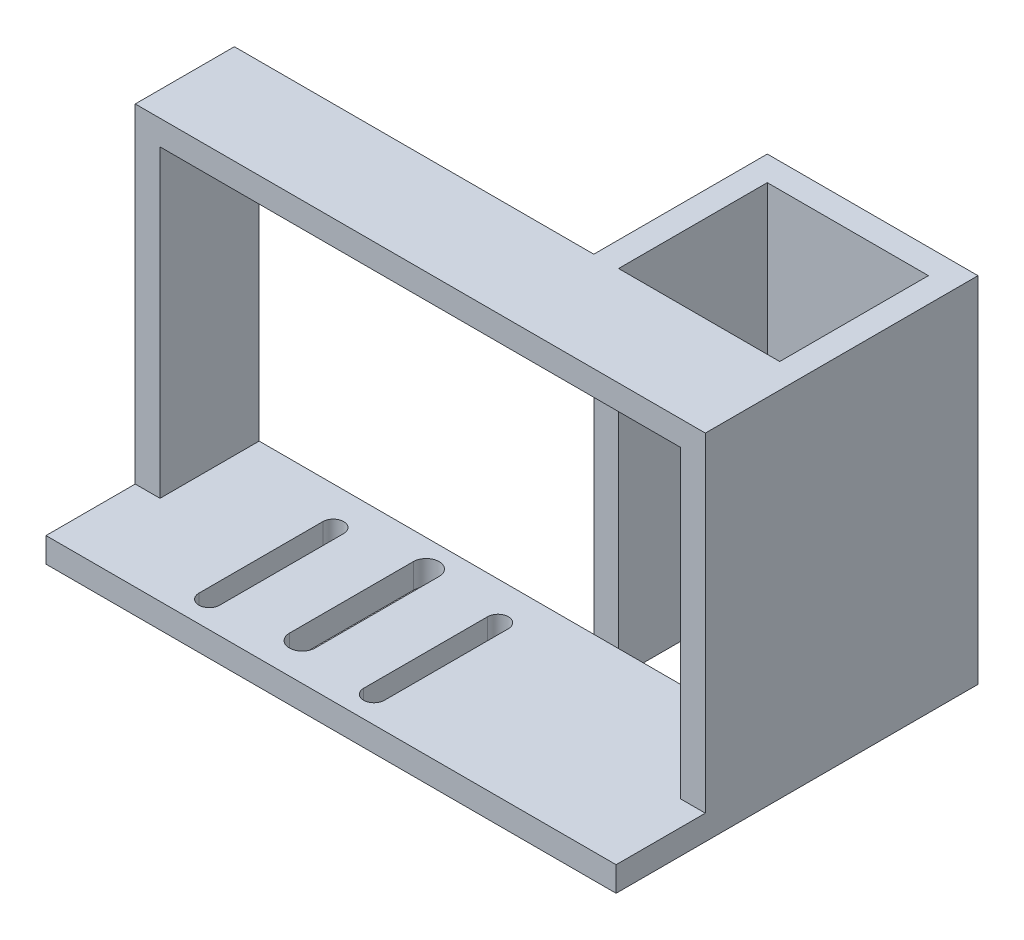
ISO-10303-21;
HEADER;
FILE_DESCRIPTION(('STEP AP214'),'2;1');
FILE_NAME('part.step','',(''),(''),'','','');
FILE_SCHEMA(('AUTOMOTIVE_DESIGN { 1 0 10303 214 1 1 1 1 }'));
ENDSEC;
DATA;
#1=APPLICATION_CONTEXT('core data for automotive mechanical design processes');
#2=APPLICATION_PROTOCOL_DEFINITION('international standard','automotive_design',2000,#1);
#3=PRODUCT_CONTEXT('',#1,'mechanical');
#4=PRODUCT('Part','Part','',(#3));
#5=PRODUCT_RELATED_PRODUCT_CATEGORY('part','',(#4));
#6=PRODUCT_DEFINITION_FORMATION('','',#4);
#7=PRODUCT_DEFINITION_CONTEXT('part definition',#1,'design');
#8=PRODUCT_DEFINITION('design','',#6,#7);
#9=PRODUCT_DEFINITION_SHAPE('','',#8);
#10=(LENGTH_UNIT() NAMED_UNIT(*) SI_UNIT(.MILLI.,.METRE.));
#11=(NAMED_UNIT(*) PLANE_ANGLE_UNIT() SI_UNIT($,.RADIAN.));
#12=(NAMED_UNIT(*) SI_UNIT($,.STERADIAN.) SOLID_ANGLE_UNIT());
#13=UNCERTAINTY_MEASURE_WITH_UNIT(LENGTH_MEASURE(1.E-05),#10,'distance_accuracy_value','');
#14=(GEOMETRIC_REPRESENTATION_CONTEXT(3) GLOBAL_UNCERTAINTY_ASSIGNED_CONTEXT((#13)) GLOBAL_UNIT_ASSIGNED_CONTEXT((#10,
#11,#12)) REPRESENTATION_CONTEXT('',''));
#15=CARTESIAN_POINT('',(0.,0.,0.));
#16=DIRECTION('',(0.,0.,1.));
#17=DIRECTION('',(1.,0.,0.));
#18=AXIS2_PLACEMENT_3D('',#15,#16,#17);
#19=CARTESIAN_POINT('',(0.,0.,25.4));
#20=DIRECTION('',(0.,0.,-1.));
#21=DIRECTION('',(-1.,0.,0.));
#22=AXIS2_PLACEMENT_3D('',#19,#20,#21);
#23=PLANE('',#22);
#24=DIRECTION('',(-1.,0.,0.));
#25=VECTOR('',#24,1.);
#26=CARTESIAN_POINT('',(0.,-38.989,25.4));
#27=LINE('',#26,#25);
#28=CARTESIAN_POINT('',(73.025,-38.989,25.4));
#29=VERTEX_POINT('',#28);
#30=CARTESIAN_POINT('',(66.675,-38.989,25.4));
#31=VERTEX_POINT('',#30);
#32=EDGE_CURVE('E350',#29,#31,#27,.T.);
#33=ORIENTED_EDGE('',*,*,#32,.F.);
#34=DIRECTION('',(0.,1.,0.));
#35=VECTOR('',#34,1.);
#36=CARTESIAN_POINT('',(73.025,-45.339,25.4));
#37=LINE('',#36,#35);
#38=CARTESIAN_POINT('',(73.025,45.339,25.4));
#39=VERTEX_POINT('',#38);
#40=EDGE_CURVE('E381',#29,#39,#37,.T.);
#41=ORIENTED_EDGE('',*,*,#40,.T.);
#42=DIRECTION('',(-1.,0.,0.));
#43=VECTOR('',#42,1.);
#44=CARTESIAN_POINT('',(-73.025,45.339,25.4));
#45=LINE('',#44,#43);
#46=CARTESIAN_POINT('',(-73.025,45.339,25.4));
#47=VERTEX_POINT('',#46);
#48=EDGE_CURVE('E380',#39,#47,#45,.T.);
#49=ORIENTED_EDGE('',*,*,#48,.T.);
#50=DIRECTION('',(0.,-1.,0.));
#51=VECTOR('',#50,1.);
#52=CARTESIAN_POINT('',(-73.025,-45.339,25.4));
#53=LINE('',#52,#51);
#54=CARTESIAN_POINT('',(-73.025,-38.989,25.4));
#55=VERTEX_POINT('',#54);
#56=EDGE_CURVE('E336',#47,#55,#53,.T.);
#57=ORIENTED_EDGE('',*,*,#56,.T.);
#58=CARTESIAN_POINT('',(-66.675,-38.989,25.4));
#59=VERTEX_POINT('',#58);
#60=EDGE_CURVE('E323',#59,#55,#27,.T.);
#61=ORIENTED_EDGE('',*,*,#60,.F.);
#62=DIRECTION('',(0.,-1.,0.));
#63=VECTOR('',#62,1.);
#64=CARTESIAN_POINT('',(-66.675,-38.989,25.4));
#65=LINE('',#64,#63);
#66=CARTESIAN_POINT('',(-66.675,38.989,25.4));
#67=VERTEX_POINT('',#66);
#68=EDGE_CURVE('E370',#67,#59,#65,.T.);
#69=ORIENTED_EDGE('',*,*,#68,.F.);
#70=DIRECTION('',(-1.,0.,0.));
#71=VECTOR('',#70,1.);
#72=CARTESIAN_POINT('',(-66.675,38.989,25.4));
#73=LINE('',#72,#71);
#74=CARTESIAN_POINT('',(66.675,38.989,25.4));
#75=VERTEX_POINT('',#74);
#76=EDGE_CURVE('E356',#75,#67,#73,.T.);
#77=ORIENTED_EDGE('',*,*,#76,.F.);
#78=DIRECTION('',(0.,1.,0.));
#79=VECTOR('',#78,1.);
#80=CARTESIAN_POINT('',(66.675,-38.989,25.4));
#81=LINE('',#80,#79);
#82=EDGE_CURVE('E359',#31,#75,#81,.T.);
#83=ORIENTED_EDGE('',*,*,#82,.F.);
#84=EDGE_LOOP('',(#33,#41,#49,#57,#61,#69,#77,#83));
#85=FACE_BOUND('',#84,.T.);
#86=ADVANCED_FACE('F37',(#85),#23,.F.);
#87=CARTESIAN_POINT('',(0.,0.,0.));
#88=DIRECTION('',(0.,0.,-1.));
#89=DIRECTION('',(-1.,0.,0.));
#90=AXIS2_PLACEMENT_3D('',#87,#88,#89);
#91=PLANE('',#90);
#92=DIRECTION('',(0.,1.,0.));
#93=VECTOR('',#92,1.);
#94=CARTESIAN_POINT('',(19.05,45.339,0.));
#95=LINE('',#94,#93);
#96=CARTESIAN_POINT('',(19.05,-45.339,0.));
#97=VERTEX_POINT('',#96);
#98=CARTESIAN_POINT('',(19.05,-38.989,0.));
#99=VERTEX_POINT('',#98);
#100=EDGE_CURVE('E280',#97,#99,#95,.T.);
#101=ORIENTED_EDGE('',*,*,#100,.F.);
#102=DIRECTION('',(1.,0.,0.));
#103=VECTOR('',#102,1.);
#104=CARTESIAN_POINT('',(-73.025,-45.339,0.));
#105=LINE('',#104,#103);
#106=CARTESIAN_POINT('',(-73.025,-45.339,0.));
#107=VERTEX_POINT('',#106);
#108=EDGE_CURVE('E382',#107,#97,#105,.T.);
#109=ORIENTED_EDGE('',*,*,#108,.F.);
#110=DIRECTION('',(0.,-1.,0.));
#111=VECTOR('',#110,1.);
#112=CARTESIAN_POINT('',(-73.025,-45.339,0.));
#113=LINE('',#112,#111);
#114=CARTESIAN_POINT('',(-73.025,45.339,0.));
#115=VERTEX_POINT('',#114);
#116=EDGE_CURVE('E392',#115,#107,#113,.T.);
#117=ORIENTED_EDGE('',*,*,#116,.F.);
#118=DIRECTION('',(-1.,0.,0.));
#119=VECTOR('',#118,1.);
#120=CARTESIAN_POINT('',(-73.025,45.339,0.));
#121=LINE('',#120,#119);
#122=CARTESIAN_POINT('',(19.05,45.339,0.));
#123=VERTEX_POINT('',#122);
#124=EDGE_CURVE('E315',#123,#115,#121,.T.);
#125=ORIENTED_EDGE('',*,*,#124,.F.);
#126=CARTESIAN_POINT('',(19.05,38.989,0.));
#127=VERTEX_POINT('',#126);
#128=EDGE_CURVE('E45',#127,#123,#95,.T.);
#129=ORIENTED_EDGE('',*,*,#128,.F.);
#130=DIRECTION('',(-1.,0.,0.));
#131=VECTOR('',#130,1.);
#132=CARTESIAN_POINT('',(-66.675,38.989,0.));
#133=LINE('',#132,#131);
#134=CARTESIAN_POINT('',(-66.675,38.989,0.));
#135=VERTEX_POINT('',#134);
#136=EDGE_CURVE('E366',#127,#135,#133,.T.);
#137=ORIENTED_EDGE('',*,*,#136,.T.);
#138=DIRECTION('',(0.,-1.,0.));
#139=VECTOR('',#138,1.);
#140=CARTESIAN_POINT('',(-66.675,-38.989,0.));
#141=LINE('',#140,#139);
#142=CARTESIAN_POINT('',(-66.675,-38.989,0.));
#143=VERTEX_POINT('',#142);
#144=EDGE_CURVE('E354',#135,#143,#141,.T.);
#145=ORIENTED_EDGE('',*,*,#144,.T.);
#146=DIRECTION('',(1.,0.,0.));
#147=VECTOR('',#146,1.);
#148=CARTESIAN_POINT('',(-66.675,-38.989,0.));
#149=LINE('',#148,#147);
#150=EDGE_CURVE('E363',#143,#99,#149,.T.);
#151=ORIENTED_EDGE('',*,*,#150,.T.);
#152=EDGE_LOOP('',(#101,#109,#117,#125,#129,#137,#145,#151));
#153=FACE_BOUND('',#152,.T.);
#154=ADVANCED_FACE('F559',(#153),#91,.T.);
#155=CARTESIAN_POINT('',(73.025,-45.339,25.4));
#156=DIRECTION('',(-1.,0.,0.));
#157=DIRECTION('',(0.,0.,1.));
#158=AXIS2_PLACEMENT_3D('',#155,#156,#157);
#159=PLANE('',#158);
#160=DIRECTION('',(0.,0.,-1.));
#161=VECTOR('',#160,1.);
#162=CARTESIAN_POINT('',(73.025,-45.339,25.4));
#163=LINE('',#162,#161);
#164=CARTESIAN_POINT('',(73.025,-45.339,48.26));
#165=VERTEX_POINT('',#164);
#166=CARTESIAN_POINT('',(73.025,-45.339,-44.45));
#167=VERTEX_POINT('',#166);
#168=EDGE_CURVE('E388',#165,#167,#163,.T.);
#169=ORIENTED_EDGE('',*,*,#168,.T.);
#170=DIRECTION('',(0.,-1.,0.));
#171=VECTOR('',#170,1.);
#172=CARTESIAN_POINT('',(73.025,45.339,-44.45));
#173=LINE('',#172,#171);
#174=CARTESIAN_POINT('',(73.025,45.339,-44.45));
#175=VERTEX_POINT('',#174);
#176=EDGE_CURVE('E276',#175,#167,#173,.T.);
#177=ORIENTED_EDGE('',*,*,#176,.F.);
#178=DIRECTION('',(0.,0.,-1.));
#179=VECTOR('',#178,1.);
#180=CARTESIAN_POINT('',(73.025,45.339,25.4));
#181=LINE('',#180,#179);
#182=EDGE_CURVE('E325',#39,#175,#181,.T.);
#183=ORIENTED_EDGE('',*,*,#182,.F.);
#184=ORIENTED_EDGE('',*,*,#40,.F.);
#185=DIRECTION('',(0.,0.,1.));
#186=VECTOR('',#185,1.);
#187=CARTESIAN_POINT('',(73.025,-38.989,0.));
#188=LINE('',#187,#186);
#189=CARTESIAN_POINT('',(73.025,-38.989,48.26));
#190=VERTEX_POINT('',#189);
#191=EDGE_CURVE('E420',#29,#190,#188,.T.);
#192=ORIENTED_EDGE('',*,*,#191,.T.);
#193=DIRECTION('',(0.,-1.,0.));
#194=VECTOR('',#193,1.);
#195=CARTESIAN_POINT('',(73.025,108.839218212897,48.26));
#196=LINE('',#195,#194);
#197=EDGE_CURVE('E421',#190,#165,#196,.T.);
#198=ORIENTED_EDGE('',*,*,#197,.T.);
#199=EDGE_LOOP('',(#169,#177,#183,#184,#192,#198));
#200=FACE_BOUND('',#199,.T.);
#201=ADVANCED_FACE('F39',(#200),#159,.F.);
#202=CARTESIAN_POINT('',(-73.025,45.339,25.4));
#203=DIRECTION('',(0.,-1.,0.));
#204=DIRECTION('',(0.,0.,-1.));
#205=AXIS2_PLACEMENT_3D('',#202,#203,#204);
#206=PLANE('',#205);
#207=DIRECTION('',(1.,0.,0.));
#208=VECTOR('',#207,1.);
#209=CARTESIAN_POINT('',(25.4,45.339,0.));
#210=LINE('',#209,#208);
#211=CARTESIAN_POINT('',(25.4,45.339,0.));
#212=VERTEX_POINT('',#211);
#213=CARTESIAN_POINT('',(66.675,45.339,0.));
#214=VERTEX_POINT('',#213);
#215=EDGE_CURVE('E259',#212,#214,#210,.T.);
#216=ORIENTED_EDGE('',*,*,#215,.F.);
#217=DIRECTION('',(0.,0.,1.));
#218=VECTOR('',#217,1.);
#219=CARTESIAN_POINT('',(25.4,45.339,-38.1));
#220=LINE('',#219,#218);
#221=CARTESIAN_POINT('',(25.4,45.339,-38.1));
#222=VERTEX_POINT('',#221);
#223=EDGE_CURVE('E52',#222,#212,#220,.T.);
#224=ORIENTED_EDGE('',*,*,#223,.F.);
#225=DIRECTION('',(-1.,0.,0.));
#226=VECTOR('',#225,1.);
#227=CARTESIAN_POINT('',(25.4,45.339,-38.1));
#228=LINE('',#227,#226);
#229=CARTESIAN_POINT('',(66.675,45.339,-38.1));
#230=VERTEX_POINT('',#229);
#231=EDGE_CURVE('E269',#230,#222,#228,.T.);
#232=ORIENTED_EDGE('',*,*,#231,.F.);
#233=DIRECTION('',(0.,0.,-1.));
#234=VECTOR('',#233,1.);
#235=CARTESIAN_POINT('',(66.675,45.339,-38.1));
#236=LINE('',#235,#234);
#237=EDGE_CURVE('E266',#214,#230,#236,.T.);
#238=ORIENTED_EDGE('',*,*,#237,.F.);
#239=EDGE_LOOP('',(#216,#224,#232,#238));
#240=FACE_BOUND('',#239,.T.);
#241=ORIENTED_EDGE('',*,*,#182,.T.);
#242=DIRECTION('',(1.,0.,0.));
#243=VECTOR('',#242,1.);
#244=CARTESIAN_POINT('',(73.025,45.339,-44.45));
#245=LINE('',#244,#243);
#246=CARTESIAN_POINT('',(19.05,45.339,-44.45));
#247=VERTEX_POINT('',#246);
#248=EDGE_CURVE('E284',#247,#175,#245,.T.);
#249=ORIENTED_EDGE('',*,*,#248,.F.);
#250=DIRECTION('',(0.,0.,1.));
#251=VECTOR('',#250,1.);
#252=CARTESIAN_POINT('',(19.05,45.339,-44.45));
#253=LINE('',#252,#251);
#254=EDGE_CURVE('E287',#247,#123,#253,.T.);
#255=ORIENTED_EDGE('',*,*,#254,.T.);
#256=ORIENTED_EDGE('',*,*,#124,.T.);
#257=DIRECTION('',(0.,0.,-1.));
#258=VECTOR('',#257,1.);
#259=CARTESIAN_POINT('',(-73.025,45.339,25.4));
#260=LINE('',#259,#258);
#261=EDGE_CURVE('E331',#47,#115,#260,.T.);
#262=ORIENTED_EDGE('',*,*,#261,.F.);
#263=ORIENTED_EDGE('',*,*,#48,.F.);
#264=EDGE_LOOP('',(#241,#249,#255,#256,#262,#263));
#265=FACE_BOUND('',#264,.T.);
#266=ADVANCED_FACE('F313',(#240,#265),#206,.F.);
#267=CARTESIAN_POINT('',(-73.025,-45.339,25.4));
#268=DIRECTION('',(1.,0.,0.));
#269=DIRECTION('',(0.,0.,-1.));
#270=AXIS2_PLACEMENT_3D('',#267,#268,#269);
#271=PLANE('',#270);
#272=ORIENTED_EDGE('',*,*,#116,.T.);
#273=DIRECTION('',(0.,0.,-1.));
#274=VECTOR('',#273,1.);
#275=CARTESIAN_POINT('',(-73.025,-45.339,25.4));
#276=LINE('',#275,#274);
#277=CARTESIAN_POINT('',(-73.025,-45.339,48.26));
#278=VERTEX_POINT('',#277);
#279=EDGE_CURVE('E385',#278,#107,#276,.T.);
#280=ORIENTED_EDGE('',*,*,#279,.F.);
#281=DIRECTION('',(0.,-1.,0.));
#282=VECTOR('',#281,1.);
#283=CARTESIAN_POINT('',(-73.025,108.839218212897,48.26));
#284=LINE('',#283,#282);
#285=CARTESIAN_POINT('',(-73.025,-38.989,48.26));
#286=VERTEX_POINT('',#285);
#287=EDGE_CURVE('E355',#286,#278,#284,.T.);
#288=ORIENTED_EDGE('',*,*,#287,.F.);
#289=DIRECTION('',(0.,0.,1.));
#290=VECTOR('',#289,1.);
#291=CARTESIAN_POINT('',(-73.025,-38.989,0.));
#292=LINE('',#291,#290);
#293=EDGE_CURVE('E339',#55,#286,#292,.T.);
#294=ORIENTED_EDGE('',*,*,#293,.F.);
#295=ORIENTED_EDGE('',*,*,#56,.F.);
#296=ORIENTED_EDGE('',*,*,#261,.T.);
#297=EDGE_LOOP('',(#272,#280,#288,#294,#295,#296));
#298=FACE_BOUND('',#297,.T.);
#299=ADVANCED_FACE('F573',(#298),#271,.F.);
#300=CARTESIAN_POINT('',(-73.025,-45.339,25.4));
#301=DIRECTION('',(0.,1.,0.));
#302=DIRECTION('',(0.,0.,1.));
#303=AXIS2_PLACEMENT_3D('',#300,#301,#302);
#304=PLANE('',#303);
#305=DIRECTION('',(1.,0.,0.));
#306=VECTOR('',#305,1.);
#307=CARTESIAN_POINT('',(25.4,-45.339,-38.1));
#308=LINE('',#307,#306);
#309=CARTESIAN_POINT('',(25.4,-45.339,-38.1));
#310=VERTEX_POINT('',#309);
#311=CARTESIAN_POINT('',(66.675,-45.339,-38.1));
#312=VERTEX_POINT('',#311);
#313=EDGE_CURVE('E257',#310,#312,#308,.T.);
#314=ORIENTED_EDGE('',*,*,#313,.F.);
#315=DIRECTION('',(0.,0.,-1.));
#316=VECTOR('',#315,1.);
#317=CARTESIAN_POINT('',(25.4,-45.339,-38.1));
#318=LINE('',#317,#316);
#319=CARTESIAN_POINT('',(25.4,-45.339,0.));
#320=VERTEX_POINT('',#319);
#321=EDGE_CURVE('E238',#320,#310,#318,.T.);
#322=ORIENTED_EDGE('',*,*,#321,.F.);
#323=DIRECTION('',(-1.,0.,0.));
#324=VECTOR('',#323,1.);
#325=CARTESIAN_POINT('',(25.4,-45.339,0.));
#326=LINE('',#325,#324);
#327=CARTESIAN_POINT('',(66.675,-45.339,0.));
#328=VERTEX_POINT('',#327);
#329=EDGE_CURVE('E247',#328,#320,#326,.T.);
#330=ORIENTED_EDGE('',*,*,#329,.F.);
#331=DIRECTION('',(0.,0.,1.));
#332=VECTOR('',#331,1.);
#333=CARTESIAN_POINT('',(66.675,-45.339,-38.1));
#334=LINE('',#333,#332);
#335=EDGE_CURVE('E60',#312,#328,#334,.T.);
#336=ORIENTED_EDGE('',*,*,#335,.F.);
#337=EDGE_LOOP('',(#314,#322,#330,#336));
#338=FACE_BOUND('',#337,.T.);
#339=DIRECTION('',(0.,0.,1.));
#340=VECTOR('',#339,1.);
#341=CARTESIAN_POINT('',(-35.32505,-45.339,9.70728646261659));
#342=LINE('',#341,#340);
#343=CARTESIAN_POINT('',(-35.32505,-45.339,9.70728646261659));
#344=VERTEX_POINT('',#343);
#345=CARTESIAN_POINT('',(-35.32505,-45.339,41.4572864626166));
#346=VERTEX_POINT('',#345);
#347=EDGE_CURVE('E308',#344,#346,#342,.T.);
#348=ORIENTED_EDGE('',*,*,#347,.F.);
#349=CARTESIAN_POINT('',(-37.99205,-45.339,9.70728646261659));
#350=DIRECTION('',(0.,1.,0.));
#351=DIRECTION('',(0.,0.,1.));
#352=AXIS2_PLACEMENT_3D('',#349,#350,#351);
#353=CIRCLE('',#352,2.667);
#354=CARTESIAN_POINT('',(-40.65905,-45.339,9.70728646261659));
#355=VERTEX_POINT('',#354);
#356=EDGE_CURVE('E521',#355,#344,#353,.F.);
#357=ORIENTED_EDGE('',*,*,#356,.F.);
#358=DIRECTION('',(0.,0.,-1.));
#359=VECTOR('',#358,1.);
#360=CARTESIAN_POINT('',(-40.65905,-45.339,9.70728646261659));
#361=LINE('',#360,#359);
#362=CARTESIAN_POINT('',(-40.65905,-45.339,41.4572864626166));
#363=VERTEX_POINT('',#362);
#364=EDGE_CURVE('E498',#363,#355,#361,.T.);
#365=ORIENTED_EDGE('',*,*,#364,.F.);
#366=CARTESIAN_POINT('',(-37.99205,-45.339,41.4572864626166));
#367=DIRECTION('',(0.,1.,0.));
#368=DIRECTION('',(0.,0.,1.));
#369=AXIS2_PLACEMENT_3D('',#366,#367,#368);
#370=CIRCLE('',#369,2.667);
#371=EDGE_CURVE('E291',#346,#363,#370,.F.);
#372=ORIENTED_EDGE('',*,*,#371,.F.);
#373=EDGE_LOOP('',(#348,#357,#365,#372));
#374=FACE_BOUND('',#373,.T.);
#375=DIRECTION('',(0.,0.,1.));
#376=VECTOR('',#375,1.);
#377=CARTESIAN_POINT('',(6.87705000000001,-45.339,9.70728646261659));
#378=LINE('',#377,#376);
#379=CARTESIAN_POINT('',(6.87705000000001,-45.339,9.70728646261659));
#380=VERTEX_POINT('',#379);
#381=CARTESIAN_POINT('',(6.87705000000002,-45.339,41.4572864626166));
#382=VERTEX_POINT('',#381);
#383=EDGE_CURVE('E493',#380,#382,#378,.T.);
#384=ORIENTED_EDGE('',*,*,#383,.F.);
#385=CARTESIAN_POINT('',(4.21005000000002,-45.339,9.70728646261659));
#386=DIRECTION('',(0.,1.,0.));
#387=DIRECTION('',(0.,0.,1.));
#388=AXIS2_PLACEMENT_3D('',#385,#386,#387);
#389=CIRCLE('',#388,2.667);
#390=CARTESIAN_POINT('',(1.54305000000002,-45.339,9.70728646261659));
#391=VERTEX_POINT('',#390);
#392=EDGE_CURVE('E490',#391,#380,#389,.F.);
#393=ORIENTED_EDGE('',*,*,#392,.F.);
#394=DIRECTION('',(0.,0.,-1.));
#395=VECTOR('',#394,1.);
#396=CARTESIAN_POINT('',(1.54305000000002,-45.339,9.70728646261659));
#397=LINE('',#396,#395);
#398=CARTESIAN_POINT('',(1.54305000000002,-45.339,41.4572864626166));
#399=VERTEX_POINT('',#398);
#400=EDGE_CURVE('E467',#399,#391,#397,.T.);
#401=ORIENTED_EDGE('',*,*,#400,.F.);
#402=CARTESIAN_POINT('',(4.21005000000002,-45.339,41.4572864626166));
#403=DIRECTION('',(0.,1.,0.));
#404=DIRECTION('',(0.,0.,1.));
#405=AXIS2_PLACEMENT_3D('',#402,#403,#404);
#406=CIRCLE('',#405,2.667);
#407=EDGE_CURVE('E496',#382,#399,#406,.F.);
#408=ORIENTED_EDGE('',*,*,#407,.F.);
#409=EDGE_LOOP('',(#384,#393,#401,#408));
#410=FACE_BOUND('',#409,.T.);
#411=DIRECTION('',(0.,0.,-1.));
#412=VECTOR('',#411,1.);
#413=CARTESIAN_POINT('',(-20.193,-45.339,38.735));
#414=LINE('',#413,#412);
#415=CARTESIAN_POINT('',(-20.193,-45.339,38.735));
#416=VERTEX_POINT('',#415);
#417=CARTESIAN_POINT('',(-20.193,-45.339,6.985));
#418=VERTEX_POINT('',#417);
#419=EDGE_CURVE('E462',#416,#418,#414,.T.);
#420=ORIENTED_EDGE('',*,*,#419,.F.);
#421=CARTESIAN_POINT('',(-16.891,-45.339,38.735));
#422=DIRECTION('',(0.,1.,0.));
#423=DIRECTION('',(0.,0.,1.));
#424=AXIS2_PLACEMENT_3D('',#421,#422,#423);
#425=CIRCLE('',#424,3.302);
#426=CARTESIAN_POINT('',(-13.589,-45.339,38.735));
#427=VERTEX_POINT('',#426);
#428=EDGE_CURVE('E459',#427,#416,#425,.F.);
#429=ORIENTED_EDGE('',*,*,#428,.F.);
#430=DIRECTION('',(0.,0.,1.));
#431=VECTOR('',#430,1.);
#432=CARTESIAN_POINT('',(-13.589,-45.339,38.735));
#433=LINE('',#432,#431);
#434=CARTESIAN_POINT('',(-13.589,-45.339,6.985));
#435=VERTEX_POINT('',#434);
#436=EDGE_CURVE('E431',#435,#427,#433,.T.);
#437=ORIENTED_EDGE('',*,*,#436,.F.);
#438=CARTESIAN_POINT('',(-16.891,-45.339,6.985));
#439=DIRECTION('',(0.,1.,0.));
#440=DIRECTION('',(0.,0.,1.));
#441=AXIS2_PLACEMENT_3D('',#438,#439,#440);
#442=CIRCLE('',#441,3.302);
#443=EDGE_CURVE('E465',#418,#435,#442,.F.);
#444=ORIENTED_EDGE('',*,*,#443,.F.);
#445=EDGE_LOOP('',(#420,#429,#437,#444));
#446=FACE_BOUND('',#445,.T.);
#447=ORIENTED_EDGE('',*,*,#108,.T.);
#448=DIRECTION('',(0.,0.,1.));
#449=VECTOR('',#448,1.);
#450=CARTESIAN_POINT('',(19.05,-45.339,-44.45));
#451=LINE('',#450,#449);
#452=CARTESIAN_POINT('',(19.05,-45.339,-44.45));
#453=VERTEX_POINT('',#452);
#454=EDGE_CURVE('E302',#453,#97,#451,.T.);
#455=ORIENTED_EDGE('',*,*,#454,.F.);
#456=DIRECTION('',(-1.,0.,0.));
#457=VECTOR('',#456,1.);
#458=CARTESIAN_POINT('',(73.025,-45.339,-44.45));
#459=LINE('',#458,#457);
#460=EDGE_CURVE('E279',#167,#453,#459,.T.);
#461=ORIENTED_EDGE('',*,*,#460,.F.);
#462=ORIENTED_EDGE('',*,*,#168,.F.);
#463=DIRECTION('',(1.,0.,0.));
#464=VECTOR('',#463,1.);
#465=CARTESIAN_POINT('',(0.,-45.339,48.26));
#466=LINE('',#465,#464);
#467=EDGE_CURVE('E344',#278,#165,#466,.T.);
#468=ORIENTED_EDGE('',*,*,#467,.F.);
#469=ORIENTED_EDGE('',*,*,#279,.T.);
#470=EDGE_LOOP('',(#447,#455,#461,#462,#468,#469));
#471=FACE_BOUND('',#470,.T.);
#472=ADVANCED_FACE('F254',(#338,#374,#410,#446,#471),#304,.F.);
#473=CARTESIAN_POINT('',(-66.675,-38.989,25.4));
#474=DIRECTION('',(1.,0.,0.));
#475=DIRECTION('',(0.,0.,-1.));
#476=AXIS2_PLACEMENT_3D('',#473,#474,#475);
#477=PLANE('',#476);
#478=ORIENTED_EDGE('',*,*,#144,.F.);
#479=DIRECTION('',(0.,0.,-1.));
#480=VECTOR('',#479,1.);
#481=CARTESIAN_POINT('',(-66.675,38.989,25.4));
#482=LINE('',#481,#480);
#483=EDGE_CURVE('E358',#67,#135,#482,.T.);
#484=ORIENTED_EDGE('',*,*,#483,.F.);
#485=ORIENTED_EDGE('',*,*,#68,.T.);
#486=DIRECTION('',(0.,0.,-1.));
#487=VECTOR('',#486,1.);
#488=CARTESIAN_POINT('',(-66.675,-38.989,25.4));
#489=LINE('',#488,#487);
#490=EDGE_CURVE('E399',#59,#143,#489,.T.);
#491=ORIENTED_EDGE('',*,*,#490,.T.);
#492=EDGE_LOOP('',(#478,#484,#485,#491));
#493=FACE_BOUND('',#492,.T.);
#494=ADVANCED_FACE('F568',(#493),#477,.T.);
#495=CARTESIAN_POINT('',(-66.675,-38.989,25.4));
#496=DIRECTION('',(0.,1.,0.));
#497=DIRECTION('',(0.,0.,1.));
#498=AXIS2_PLACEMENT_3D('',#495,#496,#497);
#499=PLANE('',#498);
#500=CARTESIAN_POINT('',(-37.99205,-38.989,9.70728646261659));
#501=DIRECTION('',(0.,1.,0.));
#502=DIRECTION('',(0.,0.,-1.));
#503=AXIS2_PLACEMENT_3D('',#500,#501,#502);
#504=CIRCLE('',#503,2.667);
#505=CARTESIAN_POINT('',(-35.32505,-38.989,9.70728646261659));
#506=VERTEX_POINT('',#505);
#507=CARTESIAN_POINT('',(-40.65905,-38.989,9.70728646261659));
#508=VERTEX_POINT('',#507);
#509=EDGE_CURVE('E519',#506,#508,#504,.T.);
#510=ORIENTED_EDGE('',*,*,#509,.F.);
#511=DIRECTION('',(0.,0.,-1.));
#512=VECTOR('',#511,1.);
#513=CARTESIAN_POINT('',(-35.32505,-38.989,9.70728646261659));
#514=LINE('',#513,#512);
#515=CARTESIAN_POINT('',(-35.32505,-38.989,41.4572864626166));
#516=VERTEX_POINT('',#515);
#517=EDGE_CURVE('E506',#516,#506,#514,.T.);
#518=ORIENTED_EDGE('',*,*,#517,.F.);
#519=CARTESIAN_POINT('',(-37.99205,-38.989,41.4572864626166));
#520=DIRECTION('',(0.,1.,0.));
#521=DIRECTION('',(0.,0.,-1.));
#522=AXIS2_PLACEMENT_3D('',#519,#520,#521);
#523=CIRCLE('',#522,2.667);
#524=CARTESIAN_POINT('',(-40.65905,-38.989,41.4572864626166));
#525=VERTEX_POINT('',#524);
#526=EDGE_CURVE('E513',#525,#516,#523,.T.);
#527=ORIENTED_EDGE('',*,*,#526,.F.);
#528=DIRECTION('',(0.,0.,1.));
#529=VECTOR('',#528,1.);
#530=CARTESIAN_POINT('',(-40.65905,-38.989,9.70728646261659));
#531=LINE('',#530,#529);
#532=EDGE_CURVE('E516',#508,#525,#531,.T.);
#533=ORIENTED_EDGE('',*,*,#532,.F.);
#534=EDGE_LOOP('',(#510,#518,#527,#533));
#535=FACE_BOUND('',#534,.T.);
#536=CARTESIAN_POINT('',(4.21005000000002,-38.989,9.70728646261659));
#537=DIRECTION('',(0.,1.,0.));
#538=DIRECTION('',(0.,0.,1.));
#539=AXIS2_PLACEMENT_3D('',#536,#537,#538);
#540=CIRCLE('',#539,2.667);
#541=CARTESIAN_POINT('',(6.87705000000001,-38.989,9.70728646261659));
#542=VERTEX_POINT('',#541);
#543=CARTESIAN_POINT('',(1.54305000000001,-38.989,9.70728646261659));
#544=VERTEX_POINT('',#543);
#545=EDGE_CURVE('E488',#542,#544,#540,.T.);
#546=ORIENTED_EDGE('',*,*,#545,.F.);
#547=DIRECTION('',(0.,0.,-1.));
#548=VECTOR('',#547,1.);
#549=CARTESIAN_POINT('',(6.87705000000001,-38.989,9.70728646261659));
#550=LINE('',#549,#548);
#551=CARTESIAN_POINT('',(6.87705000000002,-38.989,41.4572864626166));
#552=VERTEX_POINT('',#551);
#553=EDGE_CURVE('E475',#552,#542,#550,.T.);
#554=ORIENTED_EDGE('',*,*,#553,.F.);
#555=CARTESIAN_POINT('',(4.21005000000002,-38.989,41.4572864626166));
#556=DIRECTION('',(0.,1.,0.));
#557=DIRECTION('',(0.,0.,1.));
#558=AXIS2_PLACEMENT_3D('',#555,#556,#557);
#559=CIRCLE('',#558,2.667);
#560=CARTESIAN_POINT('',(1.54305000000002,-38.989,41.4572864626166));
#561=VERTEX_POINT('',#560);
#562=EDGE_CURVE('E482',#561,#552,#559,.T.);
#563=ORIENTED_EDGE('',*,*,#562,.F.);
#564=DIRECTION('',(0.,0.,1.));
#565=VECTOR('',#564,1.);
#566=CARTESIAN_POINT('',(1.54305000000002,-38.989,9.70728646261659));
#567=LINE('',#566,#565);
#568=EDGE_CURVE('E485',#544,#561,#567,.T.);
#569=ORIENTED_EDGE('',*,*,#568,.F.);
#570=EDGE_LOOP('',(#546,#554,#563,#569));
#571=FACE_BOUND('',#570,.T.);
#572=CARTESIAN_POINT('',(-16.891,-38.989,38.735));
#573=DIRECTION('',(0.,1.,0.));
#574=DIRECTION('',(0.,0.,1.));
#575=AXIS2_PLACEMENT_3D('',#572,#573,#574);
#576=CIRCLE('',#575,3.302);
#577=CARTESIAN_POINT('',(-20.193,-38.989,38.735));
#578=VERTEX_POINT('',#577);
#579=CARTESIAN_POINT('',(-13.589,-38.989,38.735));
#580=VERTEX_POINT('',#579);
#581=EDGE_CURVE('E457',#578,#580,#576,.T.);
#582=ORIENTED_EDGE('',*,*,#581,.F.);
#583=DIRECTION('',(0.,0.,1.));
#584=VECTOR('',#583,1.);
#585=CARTESIAN_POINT('',(-20.193,-38.989,38.735));
#586=LINE('',#585,#584);
#587=CARTESIAN_POINT('',(-20.193,-38.989,6.985));
#588=VERTEX_POINT('',#587);
#589=EDGE_CURVE('E446',#588,#578,#586,.T.);
#590=ORIENTED_EDGE('',*,*,#589,.F.);
#591=CARTESIAN_POINT('',(-16.891,-38.989,6.985));
#592=DIRECTION('',(0.,1.,0.));
#593=DIRECTION('',(0.,0.,1.));
#594=AXIS2_PLACEMENT_3D('',#591,#592,#593);
#595=CIRCLE('',#594,3.302);
#596=CARTESIAN_POINT('',(-13.589,-38.989,6.985));
#597=VERTEX_POINT('',#596);
#598=EDGE_CURVE('E451',#597,#588,#595,.T.);
#599=ORIENTED_EDGE('',*,*,#598,.F.);
#600=DIRECTION('',(0.,0.,-1.));
#601=VECTOR('',#600,1.);
#602=CARTESIAN_POINT('',(-13.589,-38.989,38.735));
#603=LINE('',#602,#601);
#604=EDGE_CURVE('E454',#580,#597,#603,.T.);
#605=ORIENTED_EDGE('',*,*,#604,.F.);
#606=EDGE_LOOP('',(#582,#590,#599,#605));
#607=FACE_BOUND('',#606,.T.);
#608=ORIENTED_EDGE('',*,*,#150,.F.);
#609=ORIENTED_EDGE('',*,*,#490,.F.);
#610=ORIENTED_EDGE('',*,*,#60,.T.);
#611=ORIENTED_EDGE('',*,*,#293,.T.);
#612=DIRECTION('',(1.,0.,0.));
#613=VECTOR('',#612,1.);
#614=CARTESIAN_POINT('',(0.,-38.989,48.26));
#615=LINE('',#614,#613);
#616=EDGE_CURVE('E346',#286,#190,#615,.T.);
#617=ORIENTED_EDGE('',*,*,#616,.T.);
#618=ORIENTED_EDGE('',*,*,#191,.F.);
#619=ORIENTED_EDGE('',*,*,#32,.T.);
#620=DIRECTION('',(0.,0.,-1.));
#621=VECTOR('',#620,1.);
#622=CARTESIAN_POINT('',(66.675,-38.989,25.4));
#623=LINE('',#622,#621);
#624=CARTESIAN_POINT('',(66.675,-38.989,0.));
#625=VERTEX_POINT('',#624);
#626=EDGE_CURVE('E377',#31,#625,#623,.T.);
#627=ORIENTED_EDGE('',*,*,#626,.T.);
#628=CARTESIAN_POINT('',(25.4,-38.989,0.));
#629=VERTEX_POINT('',#628);
#630=EDGE_CURVE('E362',#629,#625,#149,.T.);
#631=ORIENTED_EDGE('',*,*,#630,.F.);
#632=EDGE_CURVE('E367',#99,#629,#149,.T.);
#633=ORIENTED_EDGE('',*,*,#632,.F.);
#634=EDGE_LOOP('',(#608,#609,#610,#611,#617,#618,#619,#627,#631,#633));
#635=FACE_BOUND('',#634,.T.);
#636=ADVANCED_FACE('F541',(#535,#571,#607,#635),#499,.T.);
#637=CARTESIAN_POINT('',(66.675,-38.989,25.4));
#638=DIRECTION('',(-1.,0.,0.));
#639=DIRECTION('',(0.,0.,1.));
#640=AXIS2_PLACEMENT_3D('',#637,#638,#639);
#641=PLANE('',#640);
#642=DIRECTION('',(0.,0.,-1.));
#643=VECTOR('',#642,1.);
#644=CARTESIAN_POINT('',(66.675,38.989,25.4));
#645=LINE('',#644,#643);
#646=CARTESIAN_POINT('',(66.675,38.989,0.));
#647=VERTEX_POINT('',#646);
#648=EDGE_CURVE('E374',#75,#647,#645,.T.);
#649=ORIENTED_EDGE('',*,*,#648,.T.);
#650=DIRECTION('',(0.,1.,0.));
#651=VECTOR('',#650,1.);
#652=CARTESIAN_POINT('',(66.675,-45.34005,0.));
#653=LINE('',#652,#651);
#654=EDGE_CURVE('E243',#647,#214,#653,.T.);
#655=ORIENTED_EDGE('',*,*,#654,.T.);
#656=ORIENTED_EDGE('',*,*,#237,.T.);
#657=DIRECTION('',(0.,1.,0.));
#658=VECTOR('',#657,1.);
#659=CARTESIAN_POINT('',(66.675,-45.34005,-38.1));
#660=LINE('',#659,#658);
#661=EDGE_CURVE('E273',#312,#230,#660,.T.);
#662=ORIENTED_EDGE('',*,*,#661,.F.);
#663=ORIENTED_EDGE('',*,*,#335,.T.);
#664=EDGE_CURVE('E249',#328,#625,#653,.T.);
#665=ORIENTED_EDGE('',*,*,#664,.T.);
#666=ORIENTED_EDGE('',*,*,#626,.F.);
#667=ORIENTED_EDGE('',*,*,#82,.T.);
#668=EDGE_LOOP('',(#649,#655,#656,#662,#663,#665,#666,#667));
#669=FACE_BOUND('',#668,.T.);
#670=ADVANCED_FACE('F610',(#669),#641,.T.);
#671=CARTESIAN_POINT('',(-66.675,38.989,25.4));
#672=DIRECTION('',(0.,-1.,0.));
#673=DIRECTION('',(0.,0.,-1.));
#674=AXIS2_PLACEMENT_3D('',#671,#672,#673);
#675=PLANE('',#674);
#676=CARTESIAN_POINT('',(25.4,38.989,0.));
#677=VERTEX_POINT('',#676);
#678=EDGE_CURVE('E368',#647,#677,#133,.T.);
#679=ORIENTED_EDGE('',*,*,#678,.F.);
#680=ORIENTED_EDGE('',*,*,#648,.F.);
#681=ORIENTED_EDGE('',*,*,#76,.T.);
#682=ORIENTED_EDGE('',*,*,#483,.T.);
#683=ORIENTED_EDGE('',*,*,#136,.F.);
#684=EDGE_CURVE('E371',#677,#127,#133,.T.);
#685=ORIENTED_EDGE('',*,*,#684,.F.);
#686=EDGE_LOOP('',(#679,#680,#681,#682,#683,#685));
#687=FACE_BOUND('',#686,.T.);
#688=ADVANCED_FACE('F592',(#687),#675,.T.);
#689=CARTESIAN_POINT('',(0.,108.839218212897,48.26));
#690=DIRECTION('',(0.,0.,-1.));
#691=DIRECTION('',(-1.,0.,0.));
#692=AXIS2_PLACEMENT_3D('',#689,#690,#691);
#693=PLANE('',#692);
#694=ORIENTED_EDGE('',*,*,#616,.F.);
#695=ORIENTED_EDGE('',*,*,#287,.T.);
#696=ORIENTED_EDGE('',*,*,#467,.T.);
#697=ORIENTED_EDGE('',*,*,#197,.F.);
#698=EDGE_LOOP('',(#694,#695,#696,#697));
#699=FACE_BOUND('',#698,.T.);
#700=ADVANCED_FACE('F609',(#699),#693,.F.);
#701=CARTESIAN_POINT('',(-16.891,-45.34,38.735));
#702=DIRECTION('',(0.,1.,0.));
#703=DIRECTION('',(0.,0.,1.));
#704=AXIS2_PLACEMENT_3D('',#701,#702,#703);
#705=CYLINDRICAL_SURFACE('',#704,3.302);
#706=ORIENTED_EDGE('',*,*,#428,.T.);
#707=DIRECTION('',(0.,1.,0.));
#708=VECTOR('',#707,1.);
#709=CARTESIAN_POINT('',(-20.193,-45.34,38.735));
#710=LINE('',#709,#708);
#711=EDGE_CURVE('E434',#416,#578,#710,.T.);
#712=ORIENTED_EDGE('',*,*,#711,.T.);
#713=ORIENTED_EDGE('',*,*,#581,.T.);
#714=DIRECTION('',(0.,1.,0.));
#715=VECTOR('',#714,1.);
#716=CARTESIAN_POINT('',(-13.589,-45.34,38.735));
#717=LINE('',#716,#715);
#718=EDGE_CURVE('E443',#427,#580,#717,.T.);
#719=ORIENTED_EDGE('',*,*,#718,.F.);
#720=EDGE_LOOP('',(#706,#712,#713,#719));
#721=FACE_BOUND('',#720,.T.);
#722=ADVANCED_FACE('F788',(#721),#705,.F.);
#723=CARTESIAN_POINT('',(-20.193,-45.34,38.735));
#724=DIRECTION('',(-1.,0.,0.));
#725=DIRECTION('',(0.,0.,1.));
#726=AXIS2_PLACEMENT_3D('',#723,#724,#725);
#727=PLANE('',#726);
#728=ORIENTED_EDGE('',*,*,#419,.T.);
#729=DIRECTION('',(0.,1.,0.));
#730=VECTOR('',#729,1.);
#731=CARTESIAN_POINT('',(-20.193,-45.34,6.985));
#732=LINE('',#731,#730);
#733=EDGE_CURVE('E440',#418,#588,#732,.T.);
#734=ORIENTED_EDGE('',*,*,#733,.T.);
#735=ORIENTED_EDGE('',*,*,#589,.T.);
#736=ORIENTED_EDGE('',*,*,#711,.F.);
#737=EDGE_LOOP('',(#728,#734,#735,#736));
#738=FACE_BOUND('',#737,.T.);
#739=ADVANCED_FACE('F779',(#738),#727,.F.);
#740=CARTESIAN_POINT('',(-16.891,-45.34,6.985));
#741=DIRECTION('',(0.,1.,0.));
#742=DIRECTION('',(0.,0.,1.));
#743=AXIS2_PLACEMENT_3D('',#740,#741,#742);
#744=CYLINDRICAL_SURFACE('',#743,3.302);
#745=ORIENTED_EDGE('',*,*,#443,.T.);
#746=DIRECTION('',(0.,1.,0.));
#747=VECTOR('',#746,1.);
#748=CARTESIAN_POINT('',(-13.589,-45.34,6.985));
#749=LINE('',#748,#747);
#750=EDGE_CURVE('E445',#435,#597,#749,.T.);
#751=ORIENTED_EDGE('',*,*,#750,.T.);
#752=ORIENTED_EDGE('',*,*,#598,.T.);
#753=ORIENTED_EDGE('',*,*,#733,.F.);
#754=EDGE_LOOP('',(#745,#751,#752,#753));
#755=FACE_BOUND('',#754,.T.);
#756=ADVANCED_FACE('F771',(#755),#744,.F.);
#757=CARTESIAN_POINT('',(-13.589,-45.34,38.735));
#758=DIRECTION('',(1.,0.,0.));
#759=DIRECTION('',(0.,0.,-1.));
#760=AXIS2_PLACEMENT_3D('',#757,#758,#759);
#761=PLANE('',#760);
#762=ORIENTED_EDGE('',*,*,#436,.T.);
#763=ORIENTED_EDGE('',*,*,#718,.T.);
#764=ORIENTED_EDGE('',*,*,#604,.T.);
#765=ORIENTED_EDGE('',*,*,#750,.F.);
#766=EDGE_LOOP('',(#762,#763,#764,#765));
#767=FACE_BOUND('',#766,.T.);
#768=ADVANCED_FACE('F762',(#767),#761,.F.);
#769=CARTESIAN_POINT('',(4.21005000000002,-45.34,9.70728646261659));
#770=DIRECTION('',(0.,1.,0.));
#771=DIRECTION('',(0.,0.,1.));
#772=AXIS2_PLACEMENT_3D('',#769,#770,#771);
#773=CYLINDRICAL_SURFACE('',#772,2.667);
#774=ORIENTED_EDGE('',*,*,#392,.T.);
#775=DIRECTION('',(0.,1.,0.));
#776=VECTOR('',#775,1.);
#777=CARTESIAN_POINT('',(6.87705000000001,-45.34,9.70728646261659));
#778=LINE('',#777,#776);
#779=EDGE_CURVE('E470',#380,#542,#778,.T.);
#780=ORIENTED_EDGE('',*,*,#779,.T.);
#781=ORIENTED_EDGE('',*,*,#545,.T.);
#782=DIRECTION('',(0.,1.,0.));
#783=VECTOR('',#782,1.);
#784=CARTESIAN_POINT('',(1.54305000000002,-45.34,9.70728646261659));
#785=LINE('',#784,#783);
#786=EDGE_CURVE('E471',#391,#544,#785,.T.);
#787=ORIENTED_EDGE('',*,*,#786,.F.);
#788=EDGE_LOOP('',(#774,#780,#781,#787));
#789=FACE_BOUND('',#788,.T.);
#790=ADVANCED_FACE('F754',(#789),#773,.F.);
#791=CARTESIAN_POINT('',(6.87705000000001,-45.34,9.70728646261659));
#792=DIRECTION('',(1.,0.,0.));
#793=DIRECTION('',(0.,0.,-1.));
#794=AXIS2_PLACEMENT_3D('',#791,#792,#793);
#795=PLANE('',#794);
#796=ORIENTED_EDGE('',*,*,#383,.T.);
#797=DIRECTION('',(0.,1.,0.));
#798=VECTOR('',#797,1.);
#799=CARTESIAN_POINT('',(6.87705000000002,-45.34,41.4572864626166));
#800=LINE('',#799,#798);
#801=EDGE_CURVE('E477',#382,#552,#800,.T.);
#802=ORIENTED_EDGE('',*,*,#801,.T.);
#803=ORIENTED_EDGE('',*,*,#553,.T.);
#804=ORIENTED_EDGE('',*,*,#779,.F.);
#805=EDGE_LOOP('',(#796,#802,#803,#804));
#806=FACE_BOUND('',#805,.T.);
#807=ADVANCED_FACE('F745',(#806),#795,.F.);
#808=CARTESIAN_POINT('',(4.21005000000002,-45.34,41.4572864626166));
#809=DIRECTION('',(0.,1.,0.));
#810=DIRECTION('',(0.,0.,1.));
#811=AXIS2_PLACEMENT_3D('',#808,#809,#810);
#812=CYLINDRICAL_SURFACE('',#811,2.667);
#813=ORIENTED_EDGE('',*,*,#407,.T.);
#814=DIRECTION('',(0.,1.,0.));
#815=VECTOR('',#814,1.);
#816=CARTESIAN_POINT('',(1.54305000000002,-45.34,41.4572864626166));
#817=LINE('',#816,#815);
#818=EDGE_CURVE('E474',#399,#561,#817,.T.);
#819=ORIENTED_EDGE('',*,*,#818,.T.);
#820=ORIENTED_EDGE('',*,*,#562,.T.);
#821=ORIENTED_EDGE('',*,*,#801,.F.);
#822=EDGE_LOOP('',(#813,#819,#820,#821));
#823=FACE_BOUND('',#822,.T.);
#824=ADVANCED_FACE('F553',(#823),#812,.F.);
#825=CARTESIAN_POINT('',(1.54305000000002,-45.34,9.70728646261659));
#826=DIRECTION('',(-1.,0.,0.));
#827=DIRECTION('',(0.,0.,1.));
#828=AXIS2_PLACEMENT_3D('',#825,#826,#827);
#829=PLANE('',#828);
#830=ORIENTED_EDGE('',*,*,#400,.T.);
#831=ORIENTED_EDGE('',*,*,#786,.T.);
#832=ORIENTED_EDGE('',*,*,#568,.T.);
#833=ORIENTED_EDGE('',*,*,#818,.F.);
#834=EDGE_LOOP('',(#830,#831,#832,#833));
#835=FACE_BOUND('',#834,.T.);
#836=ADVANCED_FACE('F546',(#835),#829,.F.);
#837=CARTESIAN_POINT('',(-37.99205,-45.34,9.70728646261659));
#838=DIRECTION('',(0.,1.,0.));
#839=DIRECTION('',(0.,0.,1.));
#840=AXIS2_PLACEMENT_3D('',#837,#838,#839);
#841=CYLINDRICAL_SURFACE('',#840,2.667);
#842=ORIENTED_EDGE('',*,*,#356,.T.);
#843=DIRECTION('',(0.,1.,0.));
#844=VECTOR('',#843,1.);
#845=CARTESIAN_POINT('',(-35.32505,-45.34,9.70728646261659));
#846=LINE('',#845,#844);
#847=EDGE_CURVE('E501',#344,#506,#846,.T.);
#848=ORIENTED_EDGE('',*,*,#847,.T.);
#849=ORIENTED_EDGE('',*,*,#509,.T.);
#850=DIRECTION('',(0.,1.,0.));
#851=VECTOR('',#850,1.);
#852=CARTESIAN_POINT('',(-40.65905,-45.34,9.70728646261659));
#853=LINE('',#852,#851);
#854=EDGE_CURVE('E502',#355,#508,#853,.T.);
#855=ORIENTED_EDGE('',*,*,#854,.F.);
#856=EDGE_LOOP('',(#842,#848,#849,#855));
#857=FACE_BOUND('',#856,.T.);
#858=ADVANCED_FACE('F544',(#857),#841,.F.);
#859=CARTESIAN_POINT('',(-35.32505,-45.34,9.70728646261659));
#860=DIRECTION('',(1.,0.,0.));
#861=DIRECTION('',(0.,0.,-1.));
#862=AXIS2_PLACEMENT_3D('',#859,#860,#861);
#863=PLANE('',#862);
#864=ORIENTED_EDGE('',*,*,#347,.T.);
#865=DIRECTION('',(0.,1.,0.));
#866=VECTOR('',#865,1.);
#867=CARTESIAN_POINT('',(-35.32505,-45.34,41.4572864626166));
#868=LINE('',#867,#866);
#869=EDGE_CURVE('E508',#346,#516,#868,.T.);
#870=ORIENTED_EDGE('',*,*,#869,.T.);
#871=ORIENTED_EDGE('',*,*,#517,.T.);
#872=ORIENTED_EDGE('',*,*,#847,.F.);
#873=EDGE_LOOP('',(#864,#870,#871,#872));
#874=FACE_BOUND('',#873,.T.);
#875=ADVANCED_FACE('F527',(#874),#863,.F.);
#876=CARTESIAN_POINT('',(-37.99205,-45.34,41.4572864626166));
#877=DIRECTION('',(0.,1.,0.));
#878=DIRECTION('',(0.,0.,1.));
#879=AXIS2_PLACEMENT_3D('',#876,#877,#878);
#880=CYLINDRICAL_SURFACE('',#879,2.667);
#881=ORIENTED_EDGE('',*,*,#371,.T.);
#882=DIRECTION('',(0.,1.,0.));
#883=VECTOR('',#882,1.);
#884=CARTESIAN_POINT('',(-40.65905,-45.34,41.4572864626166));
#885=LINE('',#884,#883);
#886=EDGE_CURVE('E505',#363,#525,#885,.T.);
#887=ORIENTED_EDGE('',*,*,#886,.T.);
#888=ORIENTED_EDGE('',*,*,#526,.T.);
#889=ORIENTED_EDGE('',*,*,#869,.F.);
#890=EDGE_LOOP('',(#881,#887,#888,#889));
#891=FACE_BOUND('',#890,.T.);
#892=ADVANCED_FACE('F533',(#891),#880,.F.);
#893=CARTESIAN_POINT('',(-40.65905,-45.34,9.70728646261659));
#894=DIRECTION('',(-1.,0.,0.));
#895=DIRECTION('',(0.,0.,1.));
#896=AXIS2_PLACEMENT_3D('',#893,#894,#895);
#897=PLANE('',#896);
#898=ORIENTED_EDGE('',*,*,#364,.T.);
#899=ORIENTED_EDGE('',*,*,#854,.T.);
#900=ORIENTED_EDGE('',*,*,#532,.T.);
#901=ORIENTED_EDGE('',*,*,#886,.F.);
#902=EDGE_LOOP('',(#898,#899,#900,#901));
#903=FACE_BOUND('',#902,.T.);
#904=ADVANCED_FACE('F535',(#903),#897,.F.);
#905=CARTESIAN_POINT('',(0.,0.,0.));
#906=DIRECTION('',(0.,0.,-1.));
#907=DIRECTION('',(-1.,0.,0.));
#908=AXIS2_PLACEMENT_3D('',#905,#906,#907);
#909=PLANE('',#908);
#910=ORIENTED_EDGE('',*,*,#632,.T.);
#911=DIRECTION('',(0.,1.,0.));
#912=VECTOR('',#911,1.);
#913=CARTESIAN_POINT('',(25.4,0.,0.));
#914=LINE('',#913,#912);
#915=EDGE_CURVE('E11',#629,#677,#914,.T.);
#916=ORIENTED_EDGE('',*,*,#915,.T.);
#917=ORIENTED_EDGE('',*,*,#684,.T.);
#918=EDGE_CURVE('E251',#99,#127,#95,.T.);
#919=ORIENTED_EDGE('',*,*,#918,.F.);
#920=EDGE_LOOP('',(#910,#916,#917,#919));
#921=FACE_BOUND('',#920,.T.);
#922=ADVANCED_FACE('F590',(#921),#909,.F.);
#923=CARTESIAN_POINT('',(19.05,45.339,-44.45));
#924=DIRECTION('',(1.,0.,0.));
#925=DIRECTION('',(0.,1.,0.));
#926=AXIS2_PLACEMENT_3D('',#923,#924,#925);
#927=PLANE('',#926);
#928=ORIENTED_EDGE('',*,*,#100,.T.);
#929=ORIENTED_EDGE('',*,*,#918,.T.);
#930=ORIENTED_EDGE('',*,*,#128,.T.);
#931=ORIENTED_EDGE('',*,*,#254,.F.);
#932=DIRECTION('',(0.,1.,0.));
#933=VECTOR('',#932,1.);
#934=CARTESIAN_POINT('',(19.05,45.339,-44.45));
#935=LINE('',#934,#933);
#936=EDGE_CURVE('E282',#453,#247,#935,.T.);
#937=ORIENTED_EDGE('',*,*,#936,.F.);
#938=ORIENTED_EDGE('',*,*,#454,.T.);
#939=EDGE_LOOP('',(#928,#929,#930,#931,#937,#938));
#940=FACE_BOUND('',#939,.T.);
#941=ADVANCED_FACE('F318',(#940),#927,.F.);
#942=CARTESIAN_POINT('',(0.,0.,-44.45));
#943=DIRECTION('',(0.,0.,-1.));
#944=DIRECTION('',(-1.,0.,0.));
#945=AXIS2_PLACEMENT_3D('',#942,#943,#944);
#946=PLANE('',#945);
#947=ORIENTED_EDGE('',*,*,#176,.T.);
#948=ORIENTED_EDGE('',*,*,#460,.T.);
#949=ORIENTED_EDGE('',*,*,#936,.T.);
#950=ORIENTED_EDGE('',*,*,#248,.T.);
#951=EDGE_LOOP('',(#947,#948,#949,#950));
#952=FACE_BOUND('',#951,.T.);
#953=ADVANCED_FACE('F607',(#952),#946,.T.);
#954=CARTESIAN_POINT('',(25.4,-45.34005,0.));
#955=DIRECTION('',(0.,0.,1.));
#956=DIRECTION('',(1.,0.,0.));
#957=AXIS2_PLACEMENT_3D('',#954,#955,#956);
#958=PLANE('',#957);
#959=ORIENTED_EDGE('',*,*,#630,.T.);
#960=ORIENTED_EDGE('',*,*,#664,.F.);
#961=ORIENTED_EDGE('',*,*,#329,.T.);
#962=DIRECTION('',(0.,1.,0.));
#963=VECTOR('',#962,1.);
#964=CARTESIAN_POINT('',(25.4,-45.34005,0.));
#965=LINE('',#964,#963);
#966=EDGE_CURVE('E234',#320,#629,#965,.T.);
#967=ORIENTED_EDGE('',*,*,#966,.T.);
#968=EDGE_LOOP('',(#959,#960,#961,#967));
#969=FACE_BOUND('',#968,.T.);
#970=ADVANCED_FACE('F248',(#969),#958,.F.);
#971=CARTESIAN_POINT('',(25.4,-45.34005,-38.1));
#972=DIRECTION('',(-1.,0.,0.));
#973=DIRECTION('',(0.,0.,1.));
#974=AXIS2_PLACEMENT_3D('',#971,#972,#973);
#975=PLANE('',#974);
#976=ORIENTED_EDGE('',*,*,#321,.T.);
#977=DIRECTION('',(0.,1.,0.));
#978=VECTOR('',#977,1.);
#979=CARTESIAN_POINT('',(25.4,-45.34005,-38.1));
#980=LINE('',#979,#978);
#981=EDGE_CURVE('E252',#310,#222,#980,.T.);
#982=ORIENTED_EDGE('',*,*,#981,.T.);
#983=ORIENTED_EDGE('',*,*,#223,.T.);
#984=EDGE_CURVE('E244',#677,#212,#965,.T.);
#985=ORIENTED_EDGE('',*,*,#984,.F.);
#986=ORIENTED_EDGE('',*,*,#915,.F.);
#987=ORIENTED_EDGE('',*,*,#966,.F.);
#988=EDGE_LOOP('',(#976,#982,#983,#985,#986,#987));
#989=FACE_BOUND('',#988,.T.);
#990=ADVANCED_FACE('F236',(#989),#975,.F.);
#991=CARTESIAN_POINT('',(25.4,-45.34005,-38.1));
#992=DIRECTION('',(0.,0.,-1.));
#993=DIRECTION('',(-1.,0.,0.));
#994=AXIS2_PLACEMENT_3D('',#991,#992,#993);
#995=PLANE('',#994);
#996=ORIENTED_EDGE('',*,*,#313,.T.);
#997=ORIENTED_EDGE('',*,*,#661,.T.);
#998=ORIENTED_EDGE('',*,*,#231,.T.);
#999=ORIENTED_EDGE('',*,*,#981,.F.);
#1000=EDGE_LOOP('',(#996,#997,#998,#999));
#1001=FACE_BOUND('',#1000,.T.);
#1002=ADVANCED_FACE('F612',(#1001),#995,.F.);
#1003=ORIENTED_EDGE('',*,*,#678,.T.);
#1004=ORIENTED_EDGE('',*,*,#984,.T.);
#1005=ORIENTED_EDGE('',*,*,#215,.T.);
#1006=ORIENTED_EDGE('',*,*,#654,.F.);
#1007=EDGE_LOOP('',(#1003,#1004,#1005,#1006));
#1008=FACE_BOUND('',#1007,.T.);
#1009=ADVANCED_FACE('F585',(#1008),#958,.F.);
#1010=CLOSED_SHELL('',(#86,#154,#201,#266,#299,#472,#494,#636,#670,#688,#700,#722,#739,#756,
#768,#790,#807,#824,#836,#858,#875,#892,#904,#922,#941,#953,#970,#990,#1002,#1009));
#1011=MANIFOLD_SOLID_BREP('B2',#1010);
#1012=ADVANCED_BREP_SHAPE_REPRESENTATION('',(#18,#1011),#14);
#1013=SHAPE_DEFINITION_REPRESENTATION(#9,#1012);
ENDSEC;
END-ISO-10303-21;
